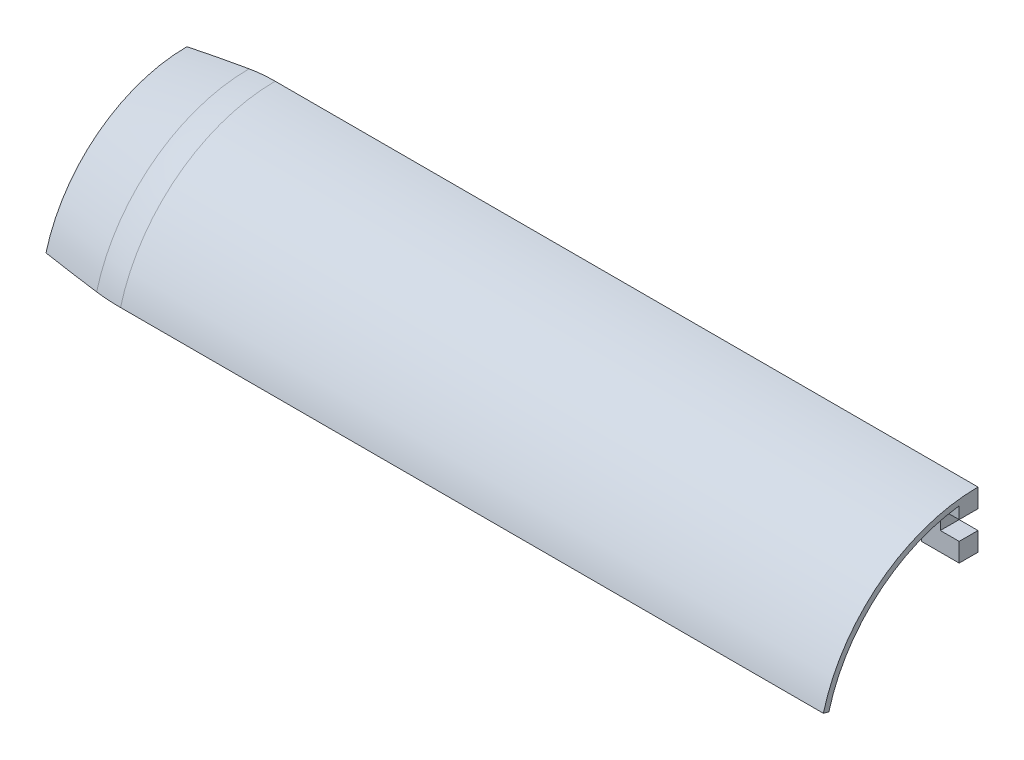
ISO-10303-21;
HEADER;
FILE_DESCRIPTION(('STEP AP214'),'2;1');
FILE_NAME('part.step','',(''),(''),'','','');
FILE_SCHEMA(('AUTOMOTIVE_DESIGN { 1 0 10303 214 1 1 1 1 }'));
ENDSEC;
DATA;
#1=APPLICATION_CONTEXT('core data for automotive mechanical design processes');
#2=APPLICATION_PROTOCOL_DEFINITION('international standard','automotive_design',2000,#1);
#3=PRODUCT_CONTEXT('',#1,'mechanical');
#4=PRODUCT('Part','Part','',(#3));
#5=PRODUCT_RELATED_PRODUCT_CATEGORY('part','',(#4));
#6=PRODUCT_DEFINITION_FORMATION('','',#4);
#7=PRODUCT_DEFINITION_CONTEXT('part definition',#1,'design');
#8=PRODUCT_DEFINITION('design','',#6,#7);
#9=PRODUCT_DEFINITION_SHAPE('','',#8);
#10=(LENGTH_UNIT() NAMED_UNIT(*) SI_UNIT(.MILLI.,.METRE.));
#11=(NAMED_UNIT(*) PLANE_ANGLE_UNIT() SI_UNIT($,.RADIAN.));
#12=(NAMED_UNIT(*) SI_UNIT($,.STERADIAN.) SOLID_ANGLE_UNIT());
#13=UNCERTAINTY_MEASURE_WITH_UNIT(LENGTH_MEASURE(1.E-05),#10,'distance_accuracy_value','');
#14=(GEOMETRIC_REPRESENTATION_CONTEXT(3) GLOBAL_UNCERTAINTY_ASSIGNED_CONTEXT((#13)) GLOBAL_UNIT_ASSIGNED_CONTEXT((#10,
#11,#12)) REPRESENTATION_CONTEXT('',''));
#15=CARTESIAN_POINT('',(0.,0.,0.));
#16=DIRECTION('',(0.,0.,1.));
#17=DIRECTION('',(1.,0.,0.));
#18=AXIS2_PLACEMENT_3D('',#15,#16,#17);
#19=CARTESIAN_POINT('',(530.,21.2119961273261,79.1642472771364));
#20=DIRECTION('',(-1.,0.,0.));
#21=DIRECTION('',(0.,0.,1.));
#22=AXIS2_PLACEMENT_3D('',#19,#20,#21);
#23=PLANE('',#22);
#24=DIRECTION('',(0.,1.,0.));
#25=VECTOR('',#24,1.);
#26=CARTESIAN_POINT('',(530.,81.956859546113,0.));
#27=LINE('',#26,#25);
#28=CARTESIAN_POINT('',(530.,55.,0.));
#29=VERTEX_POINT('',#28);
#30=CARTESIAN_POINT('',(530.,65.,0.));
#31=VERTEX_POINT('',#30);
#32=EDGE_CURVE('E220',#29,#31,#27,.T.);
#33=ORIENTED_EDGE('',*,*,#32,.T.);
#34=DIRECTION('',(0.,0.,-1.));
#35=VECTOR('',#34,1.);
#36=CARTESIAN_POINT('',(530.,65.,0.));
#37=LINE('',#36,#35);
#38=CARTESIAN_POINT('',(530.,65.,10.));
#39=VERTEX_POINT('',#38);
#40=EDGE_CURVE('E158',#39,#31,#37,.T.);
#41=ORIENTED_EDGE('',*,*,#40,.F.);
#42=DIRECTION('',(0.,-1.,0.));
#43=VECTOR('',#42,1.);
#44=CARTESIAN_POINT('',(530.,84.4097150806707,10.));
#45=LINE('',#44,#43);
#46=CARTESIAN_POINT('',(530.,55.,10.));
#47=VERTEX_POINT('',#46);
#48=EDGE_CURVE('E183',#39,#47,#45,.T.);
#49=ORIENTED_EDGE('',*,*,#48,.T.);
#50=DIRECTION('',(0.,0.,-1.));
#51=VECTOR('',#50,1.);
#52=CARTESIAN_POINT('',(530.,55.,0.));
#53=LINE('',#52,#51);
#54=EDGE_CURVE('E173',#47,#29,#53,.T.);
#55=ORIENTED_EDGE('',*,*,#54,.T.);
#56=EDGE_LOOP('',(#33,#41,#49,#55));
#57=FACE_BOUND('',#56,.T.);
#58=ADVANCED_FACE('F37',(#57),#23,.F.);
#59=CARTESIAN_POINT('',(150.,21.999618833714,82.1036952345709));
#60=CARTESIAN_POINT('',(149.933332963086,21.9966847445757,82.0927450648329));
#61=CARTESIAN_POINT('',(149.733326586977,21.9878822454263,82.0598936907736));
#62=CARTESIAN_POINT('',(149.399989369755,21.9731873612655,82.0050516364741));
#63=CARTESIAN_POINT('',(148.333178957117,21.9260724994005,81.8292165782023));
#64=CARTESIAN_POINT('',(145.198462088796,21.7867182564216,81.3091394631546));
#65=CARTESIAN_POINT('',(140.063409966275,21.5535060682111,80.4387797278088));
#66=CARTESIAN_POINT('',(133.663251007027,21.2532404153326,79.3181730554985));
#67=CARTESIAN_POINT('',(127.529872228265,20.9558385856644,78.208254316913));
#68=CARTESIAN_POINT('',(121.663178505039,20.6618353858161,77.1110194374911));
#69=CARTESIAN_POINT('',(116.063039295925,20.3718327705219,76.0287149428853));
#70=CARTESIAN_POINT('',(110.662900526555,20.0827540053217,74.9498583037688));
#71=CARTESIAN_POINT('',(105.462763855211,19.7948894494498,73.8755331555566));
#72=CARTESIAN_POINT('',(100.46263128834,19.5085646402747,72.8069544202478));
#73=CARTESIAN_POINT('',(95.6625052522908,19.2241439734207,71.7454820408259));
#74=CARTESIAN_POINT('',(91.0623885711703,18.9420346619876,70.6926357572692));
#75=CARTESIAN_POINT('',(86.6622846143895,18.6626908152326,69.650110328398));
#76=CARTESIAN_POINT('',(82.4621970688495,18.3866178123072,68.6197918548821));
#77=CARTESIAN_POINT('',(78.46213040735,18.1143763939732,67.6037730497351));
#78=CARTESIAN_POINT('',(74.6620888756832,17.8465873024523,66.6043705544663));
#79=CARTESIAN_POINT('',(70.9951359048108,17.5790502997852,65.6059088676082));
#80=CARTESIAN_POINT('',(67.4614975977933,17.31193144274,64.6090077214556));
#81=CARTESIAN_POINT('',(64.0614958695097,17.0454031162743,63.6143104654295));
#82=CARTESIAN_POINT('',(60.8615392806008,16.7853399551732,62.643741535023));
#83=CARTESIAN_POINT('',(57.7946028227797,16.5270327058151,61.6797257564551));
#84=CARTESIAN_POINT('',(54.8609921874534,16.2708187297285,60.7235221800909));
#85=CARTESIAN_POINT('',(51.9940338099678,16.0109786700254,59.7537858754372));
#86=CARTESIAN_POINT('',(49.2604049333765,15.7537120444895,58.7936537578452));
#87=CARTESIAN_POINT('',(46.6606093325559,15.4994615408708,57.8447779604903));
#88=CARTESIAN_POINT('',(44.193707143034,15.2489767414132,56.9099559623909));
#89=CARTESIAN_POINT('',(41.8601513478097,15.0028579090325,55.9914279752464));
#90=CARTESIAN_POINT('',(39.5932702297775,14.7543841176917,55.0641111616135));
#91=CARTESIAN_POINT('',(37.4597469179254,14.5112594793167,54.156757658626));
#92=CARTESIAN_POINT('',(35.3929098213764,14.2662937831752,53.2425332345145));
#93=CARTESIAN_POINT('',(33.4594457975844,14.0278960748922,52.3528208747944));
#94=CARTESIAN_POINT('',(31.5926828604072,13.788373699192,51.4589111991316));
#95=CARTESIAN_POINT('',(29.7917203934432,13.5478975782425,50.5614420977408));
#96=CARTESIAN_POINT('',(28.0582927499576,13.3064471318739,49.6603367643832));
#97=CARTESIAN_POINT('',(26.3915877567857,13.0642135961997,48.75630890195));
#98=CARTESIAN_POINT('',(24.790441055548,12.8214260788702,47.8502135518326));
#99=CARTESIAN_POINT('',(23.2571035986549,12.5781829793653,46.9424179458901));
#100=CARTESIAN_POINT('',(21.7905220441791,12.3347622735914,46.0339595043276));
#101=CARTESIAN_POINT('',(20.3891988556301,12.0914799304015,45.1260174389584));
#102=CARTESIAN_POINT('',(18.9876022764676,11.8361758965604,44.1732098132861));
#103=CARTESIAN_POINT('',(17.6543809034163,11.5804717073403,43.2189087874085));
#104=CARTESIAN_POINT('',(16.3879753215997,11.3247035989696,42.2643692120132));
#105=CARTESIAN_POINT('',(15.1861706225691,11.0692231951855,41.3109033647528));
#106=CARTESIAN_POINT('',(13.9839603207363,10.7991291966531,40.3028988394104));
#107=CARTESIAN_POINT('',(12.8510297890443,10.5288499296911,39.2942028828757));
#108=CARTESIAN_POINT('',(11.7850117433407,10.2587918718477,38.2863324900108));
#109=CARTESIAN_POINT('',(10.7826088420303,9.98931426489062,37.2806283693448));
#110=CARTESIAN_POINT('',(9.85034460299619,9.7218866438896,36.2825749004217));
#111=CARTESIAN_POINT('',(8.98508387628335,9.45725137908852,35.2949426467096));
#112=CARTESIAN_POINT('',(8.18277044424618,9.19609008232466,34.3202754182163));
#113=CARTESIAN_POINT('',(7.45148151123188,8.94118730900433,33.3689653171946));
#114=CARTESIAN_POINT('',(6.78722692689446,8.69389329151933,32.4460514795327));
#115=CARTESIAN_POINT('',(6.18542963153958,8.45554896723817,31.5565383516198));
#116=CARTESIAN_POINT('',(5.58321858881817,8.20028210803545,30.6038694635867));
#117=CARTESIAN_POINT('',(5.05331092004136,7.95811125529775,29.7000755370573));
#118=CARTESIAN_POINT('',(4.59033561481038,7.73137185104263,28.8538725602993));
#119=CARTESIAN_POINT('',(4.18913861433532,7.52252829796349,28.0744578093747));
#120=CARTESIAN_POINT('',(3.78768343871713,7.2991026398401,27.2406219015437));
#121=CARTESIAN_POINT('',(3.38587909275829,7.05832191891216,26.3420160175575));
#122=CARTESIAN_POINT('',(2.98358538597319,6.79645901339099,25.3647303495349));
#123=CARTESIAN_POINT('',(2.58057365558414,6.50830904792465,24.2893400382153));
#124=CARTESIAN_POINT('',(2.25380855212399,6.24788643176285,23.3174296032595));
#125=CARTESIAN_POINT('',(1.99350716667378,6.02041151317106,22.4684816496273));
#126=CARTESIAN_POINT('',(1.79270386413704,5.83216263964236,21.7659272891506));
#127=CARTESIAN_POINT('',(1.59169883745854,5.62841589361811,21.0055340811112));
#128=CARTESIAN_POINT('',(1.39040426817789,5.40561157891773,20.1740170585038));
#129=CARTESIAN_POINT('',(1.1886708633946,5.15866136750386,19.2523863225674));
#130=CARTESIAN_POINT('',(0.986227589019432,4.87985157629816,18.21185401614));
#131=CARTESIAN_POINT('',(0.782493434811414,4.55646326803867,17.0049524191419));
#132=CARTESIAN_POINT('',(0.57609845251901,4.16452685734478,15.542225821096));
#133=CARTESIAN_POINT('',(0.361573767311703,3.64565321011508,13.6057630069262));
#134=CARTESIAN_POINT('',(-0.0274375794679944,2.2478325689361,8.38902535417769));
#135=CARTESIAN_POINT('',(-0.01229422515827,1.00720837101644,3.7589528144421));
#136=CARTESIAN_POINT('',(0.,0.,0.));
#137=B_SPLINE_CURVE_WITH_KNOTS('',3,(#59,#60,#61,#62,#63,#64,#65,#66,#67,#68,#69,#70,#71,#72,
#73,#74,#75,#76,#77,#78,#79,#80,#81,#82,#83,#84,#85,#86,#87,#88,#89,#90,#91,#92,#93,#94,#95,#96,
#97,#98,#99,#100,#101,#102,#103,#104,#105,#106,#107,#108,#109,#110,#111,#112,#113,#114,#115,
#116,#117,#118,#119,#120,#121,#122,#123,#124,#125,#126,#127,#128,#129,#130,#131,#132,#133,#134,
#135,#136),.UNSPECIFIED.,.F.,.F.,(4,1,1,1,1,1,1,1,1,1,1,1,1,1,1,1,1,1,1,1,1,1,1,1,1,1,1,1,1,1,1,
1,1,1,1,1,1,1,1,1,1,1,1,1,1,1,1,1,1,1,1,1,1,1,1,1,1,1,1,1,1,1,1,1,1,1,1,1,1,1,1,1,1,1,1,4),(0.,
0.0010687252586431,0.00320626018393633,0.00534390825207476,0.0181722136864929,
0.0534725459687915,0.0877375176574445,0.120967753154723,0.152090007337628,0.182175910046259,
0.21122563995096,0.2392392707454,0.266216745901022,0.292157849275824,0.317062171203436,
0.340929069772287,0.363757627150992,0.385546601045925,0.406294371714183,0.425998885424918,
0.445756768666262,0.464472231486975,0.482142111039781,0.498762544311735,0.515442943349823,
0.5310723970131,0.546768661029466,0.561411566738944,0.574993781870311,0.588647474112505,
0.601234494645023,0.613898825914661,0.625487998856008,0.637159700915589,0.647744392134459,
0.658415550608988,0.669185411269821,0.678853400673226,0.688623655317672,0.698511438846342,
0.707274252510522,0.716156589654469,0.725177123576283,0.734358941510187,0.742379190684298,
0.750561858118709,0.758935380151752,0.767535832672319,0.774909459107764,0.782507468033389,
0.790374367643702,0.796900107721607,0.803673701632407,0.810745267983144,0.816283575468111,
0.822062632339849,0.828129061978545,0.834544121777166,0.839054210787859,0.843787411970255,
0.848784507322367,0.854098616344942,0.859800864190407,0.86598981856289,0.872808240763533,
0.876517565671207,0.880475407967659,0.884732346306742,0.889357005298599,0.894446203076064,
0.900143667243012,0.906678064851421,0.9144515629978,0.924294212224039,0.938537791451912,1.),.UNSPECIFIED.);
#138=CARTESIAN_POINT('',(0.,0.,0.));
#139=DIRECTION('',(-1.,0.,0.));
#140=AXIS1_PLACEMENT('',#138,#139);
#141=SURFACE_OF_REVOLUTION('',#137,#140);
#142=CARTESIAN_POINT('',(110.,0.,0.));
#143=DIRECTION('',(-1.,0.,0.));
#144=DIRECTION('',(0.,0.,1.));
#145=AXIS2_PLACEMENT_3D('',#142,#143,#144);
#146=CIRCLE('',#145,77.4478480750579);
#147=CARTESIAN_POINT('',(110.,20.0449780840314,74.8088766462106));
#148=VERTEX_POINT('',#147);
#149=CARTESIAN_POINT('',(109.999999993413,77.4478480736665,0.));
#150=VERTEX_POINT('',#149);
#151=EDGE_CURVE('E59',#148,#150,#146,.T.);
#152=ORIENTED_EDGE('',*,*,#151,.F.);
#153=CARTESIAN_POINT('',(143.011574454798,21.6869830367455,80.9369225560194));
#154=VERTEX_POINT('',#153);
#155=EDGE_CURVE('E225',#154,#148,#137,.T.);
#156=ORIENTED_EDGE('',*,*,#155,.F.);
#157=CARTESIAN_POINT('',(143.011574454798,0.,0.));
#158=DIRECTION('',(-1.,0.,0.));
#159=DIRECTION('',(0.,0.,1.));
#160=AXIS2_PLACEMENT_3D('',#157,#158,#159);
#161=CIRCLE('',#160,83.7920680379424);
#162=CARTESIAN_POINT('',(143.011574454798,83.7920680379424,0.));
#163=VERTEX_POINT('',#162);
#164=EDGE_CURVE('E313',#154,#163,#161,.T.);
#165=ORIENTED_EDGE('',*,*,#164,.T.);
#166=CARTESIAN_POINT('',(150.,85.,0.));
#167=CARTESIAN_POINT('',(149.933332963086,84.9886635500988,0.));
#168=CARTESIAN_POINT('',(149.733326586977,84.9546533050415,0.));
#169=CARTESIAN_POINT('',(149.399989369755,84.8978766325405,0.));
#170=CARTESIAN_POINT('',(148.333178957117,84.7158387850307,0.));
#171=CARTESIAN_POINT('',(145.198462088796,84.1774153358454,0.));
#172=CARTESIAN_POINT('',(140.063409966275,83.2763526334538,0.));
#173=CARTESIAN_POINT('',(133.663251007027,82.1162152380024,0.));
#174=CARTESIAN_POINT('',(127.529872228265,80.967142805754,0.));
#175=CARTESIAN_POINT('',(121.663178505039,79.8312016707734,0.));
#176=CARTESIAN_POINT('',(116.063039295925,78.7107176075573,0.));
#177=CARTESIAN_POINT('',(110.662900526555,77.5938030270026,0.));
#178=CARTESIAN_POINT('',(105.462763855211,76.481579791043,0.));
#179=CARTESIAN_POINT('',(100.46263128834,75.3753056794851,0.));
#180=CARTESIAN_POINT('',(95.6625052522908,74.2763886089064,0.));
#181=CARTESIAN_POINT('',(91.0623885711703,73.1864019299069,0.));
#182=CARTESIAN_POINT('',(86.6622846143895,72.1071001859247,0.));
#183=CARTESIAN_POINT('',(82.4621970688495,71.0404360120572,0.));
#184=CARTESIAN_POINT('',(78.46213040735,69.9885759442398,0.));
#185=CARTESIAN_POINT('',(74.6620888756832,68.9539183462456,0.));
#186=CARTESIAN_POINT('',(70.9951359048108,67.9202347447893,0.));
#187=CARTESIAN_POINT('',(67.4614975977933,66.888166733954,0.));
#188=CARTESIAN_POINT('',(64.0614958695097,65.8583803580709,0.));
#189=CARTESIAN_POINT('',(60.8615392806008,64.8535734629751,0.));
#190=CARTESIAN_POINT('',(57.7946028227797,63.8555508898842,0.));
#191=CARTESIAN_POINT('',(54.8609921874534,62.8656161036514,0.));
#192=CARTESIAN_POINT('',(51.9940338099678,61.8616712061645,0.));
#193=CARTESIAN_POINT('',(49.2604049333765,60.8676692947749,0.));
#194=CARTESIAN_POINT('',(46.6606093325559,59.8853207836057,0.));
#195=CARTESIAN_POINT('',(44.193707143034,58.91752183605,0.));
#196=CARTESIAN_POINT('',(41.8601513478097,57.9665916899193,0.));
#197=CARTESIAN_POINT('',(39.5932702297775,57.0065626810714,0.));
#198=CARTESIAN_POINT('',(37.4597469179254,56.0672012122168,0.));
#199=CARTESIAN_POINT('',(35.3929098213764,55.120726442385,0.));
#200=CARTESIAN_POINT('',(33.4594457975844,54.1996284289504,0.));
#201=CARTESIAN_POINT('',(31.5926828604072,53.2741850342985,0.));
#202=CARTESIAN_POINT('',(29.7917203934432,52.3450566509747,0.));
#203=CARTESIAN_POINT('',(28.0582927499576,51.412163763309,0.));
#204=CARTESIAN_POINT('',(26.3915877567857,50.4762452509048,0.));
#205=CARTESIAN_POINT('',(24.790441055548,49.538186317748,0.));
#206=CARTESIAN_POINT('',(23.2571035986549,48.5983671502348,0.));
#207=CARTESIAN_POINT('',(21.7905220441791,47.6578617647926,0.));
#208=CARTESIAN_POINT('',(20.3891988556301,46.7178909713236,0.));
#209=CARTESIAN_POINT('',(18.9876022764676,45.731471931952,0.));
#210=CARTESIAN_POINT('',(17.6543809034163,44.74350681092,0.));
#211=CARTESIAN_POINT('',(16.3879753215997,43.7552947252546,0.));
#212=CARTESIAN_POINT('',(15.1861706225691,42.7681942447512,0.));
#213=CARTESIAN_POINT('',(13.9839603207363,41.7246311699187,0.));
#214=CARTESIAN_POINT('',(12.8510297890443,40.6803522728424,0.));
#215=CARTESIAN_POINT('',(11.7850117433407,39.6369280621689,0.));
#216=CARTESIAN_POINT('',(10.7826088420303,38.595746541503,0.));
#217=CARTESIAN_POINT('',(9.85034460299619,37.5624855583513,0.));
#218=CARTESIAN_POINT('',(8.98508387628335,36.5400134110784,0.));
#219=CARTESIAN_POINT('',(8.18277044424618,35.530963645593,0.));
#220=CARTESIAN_POINT('',(7.45148151123188,34.5460949578217,0.));
#221=CARTESIAN_POINT('',(6.78722692689446,33.5906242451195,0.));
#222=CARTESIAN_POINT('',(6.18542963153958,32.6697324916292,0.));
#223=CARTESIAN_POINT('',(5.58321858881817,31.6834570840307,0.));
#224=CARTESIAN_POINT('',(5.05331092004136,30.7477807598956,0.));
#225=CARTESIAN_POINT('',(4.59033561481038,29.8717269742659,0.));
#226=CARTESIAN_POINT('',(4.18913861433532,29.0648174479734,0.));
#227=CARTESIAN_POINT('',(3.78768343871713,28.2015669942254,0.));
#228=CARTESIAN_POINT('',(3.38587909275829,27.2712617269582,0.));
#229=CARTESIAN_POINT('',(2.98358538597319,26.2595011533982,0.));
#230=CARTESIAN_POINT('',(2.58057365558414,25.1461751794452,0.));
#231=CARTESIAN_POINT('',(2.25380855212399,24.1399794566434,0.));
#232=CARTESIAN_POINT('',(1.99350716667378,23.2610838618401,0.));
#233=CARTESIAN_POINT('',(1.79270386413704,22.5337460669954,0.));
#234=CARTESIAN_POINT('',(1.59169883745854,21.7465290909666,0.));
#235=CARTESIAN_POINT('',(1.39040426817789,20.8856793238557,0.));
#236=CARTESIAN_POINT('',(1.1886708633946,19.9315369758068,0.));
#237=CARTESIAN_POINT('',(0.986227589019432,18.8542986640155,0.));
#238=CARTESIAN_POINT('',(0.782493434811414,17.6048221885444,0.));
#239=CARTESIAN_POINT('',(0.57609845251901,16.0904961831353,0.));
#240=CARTESIAN_POINT('',(0.361573767311703,14.0857223573754,0.));
#241=CARTESIAN_POINT('',(-0.0274375794679944,8.68495812603642,0.));
#242=CARTESIAN_POINT('',(-0.01229422515827,3.89155431207734,0.));
#243=CARTESIAN_POINT('',(0.,0.,0.));
#244=B_SPLINE_CURVE_WITH_KNOTS('',3,(#166,#167,#168,#169,#170,#171,#172,#173,#174,#175,#176,
#177,#178,#179,#180,#181,#182,#183,#184,#185,#186,#187,#188,#189,#190,#191,#192,#193,#194,#195,
#196,#197,#198,#199,#200,#201,#202,#203,#204,#205,#206,#207,#208,#209,#210,#211,#212,#213,#214,
#215,#216,#217,#218,#219,#220,#221,#222,#223,#224,#225,#226,#227,#228,#229,#230,#231,#232,#233,
#234,#235,#236,#237,#238,#239,#240,#241,#242,#243),.UNSPECIFIED.,.F.,.F.,(4,1,1,1,1,1,1,1,1,1,1,
1,1,1,1,1,1,1,1,1,1,1,1,1,1,1,1,1,1,1,1,1,1,1,1,1,1,1,1,1,1,1,1,1,1,1,1,1,1,1,1,1,1,1,1,1,1,1,1,
1,1,1,1,1,1,1,1,1,1,1,1,1,1,1,1,4),(0.,0.0010687252586431,0.00320626018393633,
0.00534390825207476,0.0181722136864929,0.0534725459687915,0.0877375176574445,0.120967753154723,
0.152090007337628,0.182175910046259,0.21122563995096,0.2392392707454,0.266216745901022,
0.292157849275824,0.317062171203436,0.340929069772287,0.363757627150992,0.385546601045925,
0.406294371714183,0.425998885424918,0.445756768666262,0.464472231486975,0.482142111039781,
0.498762544311735,0.515442943349823,0.5310723970131,0.546768661029466,0.561411566738944,
0.574993781870311,0.588647474112505,0.601234494645023,0.613898825914661,0.625487998856008,
0.637159700915589,0.647744392134459,0.658415550608988,0.669185411269821,0.678853400673226,
0.688623655317672,0.698511438846342,0.707274252510522,0.716156589654469,0.725177123576283,
0.734358941510187,0.742379190684298,0.750561858118709,0.758935380151752,0.767535832672319,
0.774909459107764,0.782507468033389,0.790374367643702,0.796900107721607,0.803673701632407,
0.810745267983144,0.816283575468111,0.822062632339849,0.828129061978545,0.834544121777166,
0.839054210787859,0.843787411970255,0.848784507322367,0.854098616344942,0.859800864190407,
0.86598981856289,0.872808240763533,0.876517565671207,0.880475407967659,0.884732346306742,
0.889357005298599,0.894446203076064,0.900143667243012,0.906678064851421,0.9144515629978,
0.924294212224039,0.938537791451912,1.),.UNSPECIFIED.);
#245=EDGE_CURVE('E202',#163,#150,#244,.T.);
#246=ORIENTED_EDGE('',*,*,#245,.T.);
#247=EDGE_LOOP('',(#152,#156,#165,#246));
#248=FACE_BOUND('',#247,.T.);
#249=ADVANCED_FACE('F240',(#248),#141,.T.);
#250=CARTESIAN_POINT('',(2.99998502922989,0.00245297648317682,0.00915463286498761));
#251=CARTESIAN_POINT('',(2.99378515333313,0.510379813846981,1.9047633964345));
#252=CARTESIAN_POINT('',(2.98195040978965,1.53196445841474,5.71736919419362));
#253=CARTESIAN_POINT('',(3.14536866129644,3.02998172837799,11.3080457563122));
#254=CARTESIAN_POINT('',(3.67380568909732,4.49011061965403,16.7573209641536));
#255=CARTESIAN_POINT('',(4.82699544242553,5.89020638688109,21.9825495029072));
#256=CARTESIAN_POINT('',(6.76738537381217,7.20782888698354,26.8999836184855));
#257=CARTESIAN_POINT('',(10.4622641517895,8.82730131497203,32.9439370011956));
#258=CARTESIAN_POINT('',(16.9322549212883,10.562110743851,39.4183339312216));
#259=CARTESIAN_POINT('',(26.3776177431232,12.2314373226928,45.6483455378845));
#260=CARTESIAN_POINT('',(36.6730106596153,13.6067155841847,50.780953884317));
#261=CARTESIAN_POINT('',(47.4413847705489,14.7736627697221,55.1360600704922));
#262=CARTESIAN_POINT('',(62.1774895395736,16.12711152704,60.1871995982437));
#263=CARTESIAN_POINT('',(81.0422134548498,17.5369417430137,65.4487575943033));
#264=CARTESIAN_POINT('',(104.01815223485,18.9504483026532,70.72403589171));
#265=CARTESIAN_POINT('',(126.982089982513,20.1604430503343,75.2397977669472));
#266=CARTESIAN_POINT('',(142.389605545499,20.8763328822037,77.9115349921061));
#267=CARTESIAN_POINT('',(150.167563431523,21.2193872790099,79.1918314307464));
#268=CARTESIAN_POINT('',(150.377257553914,21.2286193611267,79.2262860302661));
#269=CARTESIAN_POINT('',(150.502918144044,21.2341498210013,79.2469259875074));
#270=B_SPLINE_CURVE_WITH_KNOTS('',3,(#250,#251,#252,#253,#254,#255,#256,#257,#258,#259,#260,
#261,#262,#263,#264,#265,#266,#267,#268,#269),.UNSPECIFIED.,.F.,.F.,(4,1,1,1,1,1,1,1,1,1,1,1,1,
1,1,1,1,4),(0.,0.03125,0.0625,0.09375,0.125,0.15625,0.1875,0.25,0.3125,0.375,0.4375,0.5,0.625,
0.75,0.875,0.996633750979396,0.997980250587638,1.),.UNSPECIFIED.);
#271=CARTESIAN_POINT('',(0.,0.,0.));
#272=DIRECTION('',(-1.,0.,0.));
#273=AXIS1_PLACEMENT('',#271,#272);
#274=SURFACE_OF_REVOLUTION('',#270,#273);
#275=CARTESIAN_POINT('',(110.,0.,0.));
#276=DIRECTION('',(-1.,0.,0.));
#277=DIRECTION('',(0.,0.,1.));
#278=AXIS2_PLACEMENT_3D('',#275,#276,#277);
#279=CIRCLE('',#278,74.3816262334599);
#280=CARTESIAN_POINT('',(110.,74.3816262334599,0.));
#281=VERTEX_POINT('',#280);
#282=CARTESIAN_POINT('',(110.,19.2513814749155,71.8471337802797));
#283=VERTEX_POINT('',#282);
#284=EDGE_CURVE('E196',#281,#283,#279,.F.);
#285=ORIENTED_EDGE('',*,*,#284,.F.);
#286=CARTESIAN_POINT('',(2.99998502922989,0.00947757334552098,0.));
#287=CARTESIAN_POINT('',(2.99378515333313,1.97195617364565,0.));
#288=CARTESIAN_POINT('',(2.98195040978965,5.91905614135904,0.));
#289=CARTESIAN_POINT('',(3.14536866129644,11.7069504184973,0.));
#290=CARTESIAN_POINT('',(3.67380568909732,17.3484552416747,0.));
#291=CARTESIAN_POINT('',(4.82699544242553,22.7580098850453,0.));
#292=CARTESIAN_POINT('',(6.76738537381217,27.8489122936395,0.));
#293=CARTESIAN_POINT('',(10.4622641517895,34.1060732662681,0.));
#294=CARTESIAN_POINT('',(16.9322549212883,40.8088621904442,0.));
#295=CARTESIAN_POINT('',(26.3776177431232,47.2586448105006,0.));
#296=CARTESIAN_POINT('',(36.6730106596153,52.5723119749363,0.));
#297=CARTESIAN_POINT('',(47.4413847705489,57.08104967264,0.));
#298=CARTESIAN_POINT('',(62.1774895395736,62.310374109649,0.));
#299=CARTESIAN_POINT('',(81.0422134548498,67.7575397748157,0.));
#300=CARTESIAN_POINT('',(104.01815223485,73.2189097411551,0.));
#301=CARTESIAN_POINT('',(126.982089982513,77.8939704469921,0.));
#302=CARTESIAN_POINT('',(142.389605545499,80.659956356514,0.));
#303=CARTESIAN_POINT('',(150.167563431523,81.9854167633022,0.));
#304=CARTESIAN_POINT('',(150.377257553914,82.0210867894906,0.));
#305=CARTESIAN_POINT('',(150.502918144044,82.0424548455871,0.));
#306=B_SPLINE_CURVE_WITH_KNOTS('',3,(#286,#287,#288,#289,#290,#291,#292,#293,#294,#295,#296,
#297,#298,#299,#300,#301,#302,#303,#304,#305),.UNSPECIFIED.,.F.,.F.,(4,1,1,1,1,1,1,1,1,1,1,1,1,
1,1,1,1,4),(0.,0.03125,0.0625,0.09375,0.125,0.15625,0.1875,0.25,0.3125,0.375,0.4375,0.5,0.625,
0.75,0.875,0.996633750979396,0.997980250587638,1.),.UNSPECIFIED.);
#307=CARTESIAN_POINT('',(142.99356344036,80.7428237295815,0.));
#308=VERTEX_POINT('',#307);
#309=EDGE_CURVE('E207',#281,#308,#306,.T.);
#310=ORIENTED_EDGE('',*,*,#309,.T.);
#311=CARTESIAN_POINT('',(142.99356344036,0.,0.));
#312=DIRECTION('',(-1.,0.,0.));
#313=DIRECTION('',(0.,0.,1.));
#314=AXIS2_PLACEMENT_3D('',#311,#312,#313);
#315=CIRCLE('',#314,80.7428237295816);
#316=CARTESIAN_POINT('',(142.99356344036,20.8977805365712,77.9915787279087));
#317=VERTEX_POINT('',#316);
#318=EDGE_CURVE('E299',#308,#317,#315,.F.);
#319=ORIENTED_EDGE('',*,*,#318,.T.);
#320=EDGE_CURVE('E231',#283,#317,#270,.T.);
#321=ORIENTED_EDGE('',*,*,#320,.F.);
#322=EDGE_LOOP('',(#285,#310,#319,#321));
#323=FACE_BOUND('',#322,.T.);
#324=ADVANCED_FACE('F244',(#323),#274,.T.);
#325=CARTESIAN_POINT('',(57.5770541421168,16.5067894793465,61.6041770067651));
#326=DIRECTION('',(0.,-0.965925826289069,0.258819045102518));
#327=DIRECTION('',(1.,0.,0.));
#328=AXIS2_PLACEMENT_3D('',#325,#326,#327);
#329=PLANE('',#328);
#330=ORIENTED_EDGE('',*,*,#155,.T.);
#331=DIRECTION('',(0.,-0.258819045102518,-0.965925826289069));
#332=VECTOR('',#331,1.);
#333=CARTESIAN_POINT('',(110.,16.5067894793465,61.6041770067651));
#334=LINE('',#333,#332);
#335=EDGE_CURVE('E199',#148,#283,#334,.T.);
#336=ORIENTED_EDGE('',*,*,#335,.T.);
#337=ORIENTED_EDGE('',*,*,#320,.T.);
#338=CARTESIAN_POINT('',(156.877793620085,0.506472519128606,1.89018117402538));
#339=DIRECTION('',(0.,-0.965925826289069,0.258819045102518));
#340=DIRECTION('',(0.,-0.258819045102518,-0.965925826289069));
#341=AXIS2_PLACEMENT_3D('',#338,#339,#340);
#342=CIRCLE('',#341,80.);
#343=CARTESIAN_POINT('',(156.877793620085,21.2119961273262,79.1642472771364));
#344=VERTEX_POINT('',#343);
#345=EDGE_CURVE('E311',#317,#344,#342,.F.);
#346=ORIENTED_EDGE('',*,*,#345,.T.);
#347=DIRECTION('',(1.,0.,0.));
#348=VECTOR('',#347,1.);
#349=CARTESIAN_POINT('',(150.,21.2119961273262,79.1642472771364));
#350=LINE('',#349,#348);
#351=CARTESIAN_POINT('',(530.,21.2119961273261,79.1642472771364));
#352=VERTEX_POINT('',#351);
#353=EDGE_CURVE('E298',#344,#352,#350,.T.);
#354=ORIENTED_EDGE('',*,*,#353,.T.);
#355=DIRECTION('',(0.,0.258819045102518,0.965925826289069));
#356=VECTOR('',#355,1.);
#357=CARTESIAN_POINT('',(530.,21.2119961273261,79.1642472771364));
#358=LINE('',#357,#356);
#359=CARTESIAN_POINT('',(530.,21.999618833714,82.1036952345709));
#360=VERTEX_POINT('',#359);
#361=EDGE_CURVE('E334',#352,#360,#358,.T.);
#362=ORIENTED_EDGE('',*,*,#361,.T.);
#363=DIRECTION('',(-1.,0.,0.));
#364=VECTOR('',#363,1.);
#365=CARTESIAN_POINT('',(150.,21.999618833714,82.1036952345709));
#366=LINE('',#365,#364);
#367=CARTESIAN_POINT('',(156.861123700324,21.999618833714,82.1036952345709));
#368=VERTEX_POINT('',#367);
#369=EDGE_CURVE('E326',#360,#368,#366,.T.);
#370=ORIENTED_EDGE('',*,*,#369,.T.);
#371=CARTESIAN_POINT('',(156.861123700324,1.29409522551259,4.82962913144535));
#372=DIRECTION('',(0.,-0.965925826289069,0.258819045102518));
#373=DIRECTION('',(0.,-0.258819045102518,-0.965925826289069));
#374=AXIS2_PLACEMENT_3D('',#371,#372,#373);
#375=CIRCLE('',#374,80.);
#376=EDGE_CURVE('E45',#368,#154,#375,.T.);
#377=ORIENTED_EDGE('',*,*,#376,.T.);
#378=EDGE_LOOP('',(#330,#336,#337,#346,#354,#362,#370,#377));
#379=FACE_BOUND('',#378,.T.);
#380=ADVANCED_FACE('F246',(#379),#329,.T.);
#381=CARTESIAN_POINT('',(57.5770541421168,63.7773370688704,0.));
#382=DIRECTION('',(0.,0.,1.));
#383=DIRECTION('',(1.,0.,0.));
#384=AXIS2_PLACEMENT_3D('',#381,#382,#383);
#385=PLANE('',#384);
#386=DIRECTION('',(0.,1.,0.));
#387=VECTOR('',#386,1.);
#388=CARTESIAN_POINT('',(520.,65.,0.));
#389=LINE('',#388,#387);
#390=CARTESIAN_POINT('',(520.,65.,0.));
#391=VERTEX_POINT('',#390);
#392=CARTESIAN_POINT('',(520.,75.,0.));
#393=VERTEX_POINT('',#392);
#394=EDGE_CURVE('E149',#391,#393,#389,.T.);
#395=ORIENTED_EDGE('',*,*,#394,.F.);
#396=DIRECTION('',(1.,0.,0.));
#397=VECTOR('',#396,1.);
#398=CARTESIAN_POINT('',(520.,65.,0.));
#399=LINE('',#398,#397);
#400=EDGE_CURVE('E281',#391,#31,#399,.T.);
#401=ORIENTED_EDGE('',*,*,#400,.T.);
#402=ORIENTED_EDGE('',*,*,#32,.F.);
#403=DIRECTION('',(1.,0.,0.));
#404=VECTOR('',#403,1.);
#405=CARTESIAN_POINT('',(510.,55.,0.));
#406=LINE('',#405,#404);
#407=CARTESIAN_POINT('',(510.,55.,0.));
#408=VERTEX_POINT('',#407);
#409=EDGE_CURVE('E186',#408,#29,#406,.T.);
#410=ORIENTED_EDGE('',*,*,#409,.F.);
#411=DIRECTION('',(0.,1.,0.));
#412=VECTOR('',#411,1.);
#413=CARTESIAN_POINT('',(510.,85.,0.));
#414=LINE('',#413,#412);
#415=CARTESIAN_POINT('',(510.,81.9568595461281,0.));
#416=VERTEX_POINT('',#415);
#417=EDGE_CURVE('E176',#408,#416,#414,.T.);
#418=ORIENTED_EDGE('',*,*,#417,.T.);
#419=DIRECTION('',(1.,0.,0.));
#420=VECTOR('',#419,1.);
#421=CARTESIAN_POINT('',(150.,81.956859546113,0.));
#422=LINE('',#421,#420);
#423=CARTESIAN_POINT('',(156.877793620085,81.956859546113,0.));
#424=VERTEX_POINT('',#423);
#425=EDGE_CURVE('E214',#424,#416,#422,.T.);
#426=ORIENTED_EDGE('',*,*,#425,.F.);
#427=CARTESIAN_POINT('',(156.877793620085,1.95685954612804,0.));
#428=DIRECTION('',(0.,0.,1.));
#429=DIRECTION('',(1.,0.,0.));
#430=AXIS2_PLACEMENT_3D('',#427,#428,#429);
#431=CIRCLE('',#430,80.);
#432=EDGE_CURVE('E303',#424,#308,#431,.T.);
#433=ORIENTED_EDGE('',*,*,#432,.T.);
#434=ORIENTED_EDGE('',*,*,#309,.F.);
#435=DIRECTION('',(0.,-1.,0.));
#436=VECTOR('',#435,1.);
#437=CARTESIAN_POINT('',(110.,63.7773370688704,0.));
#438=LINE('',#437,#436);
#439=EDGE_CURVE('E11',#150,#281,#438,.T.);
#440=ORIENTED_EDGE('',*,*,#439,.F.);
#441=ORIENTED_EDGE('',*,*,#245,.F.);
#442=CARTESIAN_POINT('',(156.861123700324,5.,0.));
#443=DIRECTION('',(0.,0.,1.));
#444=DIRECTION('',(1.,0.,0.));
#445=AXIS2_PLACEMENT_3D('',#442,#443,#444);
#446=CIRCLE('',#445,80.);
#447=CARTESIAN_POINT('',(156.861123700324,85.,0.));
#448=VERTEX_POINT('',#447);
#449=EDGE_CURVE('E316',#163,#448,#446,.F.);
#450=ORIENTED_EDGE('',*,*,#449,.T.);
#451=DIRECTION('',(-1.,0.,0.));
#452=VECTOR('',#451,1.);
#453=CARTESIAN_POINT('',(150.,85.,0.));
#454=LINE('',#453,#452);
#455=CARTESIAN_POINT('',(530.,85.,0.));
#456=VERTEX_POINT('',#455);
#457=EDGE_CURVE('E223',#456,#448,#454,.T.);
#458=ORIENTED_EDGE('',*,*,#457,.F.);
#459=CARTESIAN_POINT('',(530.,75.,0.));
#460=VERTEX_POINT('',#459);
#461=EDGE_CURVE('E163',#460,#456,#27,.T.);
#462=ORIENTED_EDGE('',*,*,#461,.F.);
#463=DIRECTION('',(1.,0.,0.));
#464=VECTOR('',#463,1.);
#465=CARTESIAN_POINT('',(520.,75.,0.));
#466=LINE('',#465,#464);
#467=EDGE_CURVE('E143',#393,#460,#466,.T.);
#468=ORIENTED_EDGE('',*,*,#467,.F.);
#469=EDGE_LOOP('',(#395,#401,#402,#410,#418,#426,#433,#434,#440,#441,#450,#458,#462,#468));
#470=FACE_BOUND('',#469,.T.);
#471=ADVANCED_FACE('F161',(#470),#385,.F.);
#472=CARTESIAN_POINT('',(0.,0.,0.));
#473=DIRECTION('',(-1.,0.,0.));
#474=DIRECTION('',(0.,0.,1.));
#475=AXIS2_PLACEMENT_3D('',#472,#473,#474);
#476=CYLINDRICAL_SURFACE('',#475,81.9568595461281);
#477=CARTESIAN_POINT('',(510.,0.,0.));
#478=DIRECTION('',(1.,0.,0.));
#479=DIRECTION('',(0.,0.,-1.));
#480=AXIS2_PLACEMENT_3D('',#477,#478,#479);
#481=CIRCLE('',#480,81.9568595461281);
#482=CARTESIAN_POINT('',(510.,81.3444947532638,10.));
#483=VERTEX_POINT('',#482);
#484=EDGE_CURVE('E189',#483,#416,#481,.F.);
#485=ORIENTED_EDGE('',*,*,#484,.F.);
#486=DIRECTION('',(-1.,0.,0.));
#487=VECTOR('',#486,1.);
#488=CARTESIAN_POINT('',(0.,81.3444947532638,10.));
#489=LINE('',#488,#487);
#490=CARTESIAN_POINT('',(530.,81.3444947532486,10.));
#491=VERTEX_POINT('',#490);
#492=EDGE_CURVE('E193',#483,#491,#489,.F.);
#493=ORIENTED_EDGE('',*,*,#492,.T.);
#494=CARTESIAN_POINT('',(530.,0.,0.));
#495=DIRECTION('',(-1.,0.,0.));
#496=DIRECTION('',(0.,0.,1.));
#497=AXIS2_PLACEMENT_3D('',#494,#495,#496);
#498=CIRCLE('',#497,81.956859546113);
#499=EDGE_CURVE('E300',#352,#491,#498,.T.);
#500=ORIENTED_EDGE('',*,*,#499,.F.);
#501=ORIENTED_EDGE('',*,*,#353,.F.);
#502=CARTESIAN_POINT('',(156.877793620085,0.,0.));
#503=DIRECTION('',(-1.,0.,0.));
#504=DIRECTION('',(0.,0.,1.));
#505=AXIS2_PLACEMENT_3D('',#502,#503,#504);
#506=CIRCLE('',#505,81.9568595461281);
#507=EDGE_CURVE('E296',#344,#424,#506,.T.);
#508=ORIENTED_EDGE('',*,*,#507,.T.);
#509=ORIENTED_EDGE('',*,*,#425,.T.);
#510=EDGE_LOOP('',(#485,#493,#500,#501,#508,#509));
#511=FACE_BOUND('',#510,.T.);
#512=ADVANCED_FACE('F256',(#511),#476,.F.);
#513=CARTESIAN_POINT('',(530.,75.,10.));
#514=VERTEX_POINT('',#513);
#515=EDGE_CURVE('E180',#491,#514,#45,.T.);
#516=ORIENTED_EDGE('',*,*,#515,.T.);
#517=DIRECTION('',(0.,0.,1.));
#518=VECTOR('',#517,1.);
#519=CARTESIAN_POINT('',(530.,75.,0.));
#520=LINE('',#519,#518);
#521=EDGE_CURVE('E339',#460,#514,#520,.T.);
#522=ORIENTED_EDGE('',*,*,#521,.F.);
#523=ORIENTED_EDGE('',*,*,#461,.T.);
#524=CARTESIAN_POINT('',(530.,0.,0.));
#525=DIRECTION('',(-1.,0.,0.));
#526=DIRECTION('',(0.,0.,1.));
#527=AXIS2_PLACEMENT_3D('',#524,#525,#526);
#528=CIRCLE('',#527,85.);
#529=EDGE_CURVE('E306',#360,#456,#528,.T.);
#530=ORIENTED_EDGE('',*,*,#529,.F.);
#531=ORIENTED_EDGE('',*,*,#361,.F.);
#532=ORIENTED_EDGE('',*,*,#499,.T.);
#533=EDGE_LOOP('',(#516,#522,#523,#530,#531,#532));
#534=FACE_BOUND('',#533,.T.);
#535=ADVANCED_FACE('F252',(#534),#23,.F.);
#536=CARTESIAN_POINT('',(0.,0.,0.));
#537=DIRECTION('',(-1.,0.,0.));
#538=DIRECTION('',(0.,0.,1.));
#539=AXIS2_PLACEMENT_3D('',#536,#537,#538);
#540=CYLINDRICAL_SURFACE('',#539,85.);
#541=ORIENTED_EDGE('',*,*,#529,.T.);
#542=ORIENTED_EDGE('',*,*,#457,.T.);
#543=CARTESIAN_POINT('',(156.861123700324,0.,0.));
#544=DIRECTION('',(1.,0.,0.));
#545=DIRECTION('',(0.,0.,-1.));
#546=AXIS2_PLACEMENT_3D('',#543,#544,#545);
#547=CIRCLE('',#546,85.);
#548=EDGE_CURVE('E319',#448,#368,#547,.T.);
#549=ORIENTED_EDGE('',*,*,#548,.T.);
#550=ORIENTED_EDGE('',*,*,#369,.F.);
#551=EDGE_LOOP('',(#541,#542,#549,#550));
#552=FACE_BOUND('',#551,.T.);
#553=ADVANCED_FACE('F248',(#552),#540,.T.);
#554=CARTESIAN_POINT('',(156.877793620085,0.,0.));
#555=DIRECTION('',(-1.,0.,0.));
#556=DIRECTION('',(0.,0.,1.));
#557=AXIS2_PLACEMENT_3D('',#554,#555,#556);
#558=DEGENERATE_TOROIDAL_SURFACE('',#557,1.95685954612804,80.,.T.);
#559=ORIENTED_EDGE('',*,*,#345,.F.);
#560=ORIENTED_EDGE('',*,*,#318,.F.);
#561=ORIENTED_EDGE('',*,*,#432,.F.);
#562=ORIENTED_EDGE('',*,*,#507,.F.);
#563=EDGE_LOOP('',(#559,#560,#561,#562));
#564=FACE_BOUND('',#563,.T.);
#565=ADVANCED_FACE('F251',(#564),#558,.F.);
#566=CARTESIAN_POINT('',(156.861123700324,0.,0.));
#567=DIRECTION('',(1.,0.,0.));
#568=DIRECTION('',(0.,0.,-1.));
#569=AXIS2_PLACEMENT_3D('',#566,#567,#568);
#570=DEGENERATE_TOROIDAL_SURFACE('',#569,5.,80.,.T.);
#571=ORIENTED_EDGE('',*,*,#376,.F.);
#572=ORIENTED_EDGE('',*,*,#548,.F.);
#573=ORIENTED_EDGE('',*,*,#449,.F.);
#574=ORIENTED_EDGE('',*,*,#164,.F.);
#575=EDGE_LOOP('',(#571,#572,#573,#574));
#576=FACE_BOUND('',#575,.T.);
#577=ADVANCED_FACE('F39',(#576),#570,.T.);
#578=CARTESIAN_POINT('',(110.,159.,104.453052002356));
#579=DIRECTION('',(-1.,0.,0.));
#580=DIRECTION('',(0.,0.,1.));
#581=AXIS2_PLACEMENT_3D('',#578,#579,#580);
#582=PLANE('',#581);
#583=ORIENTED_EDGE('',*,*,#151,.T.);
#584=ORIENTED_EDGE('',*,*,#439,.T.);
#585=ORIENTED_EDGE('',*,*,#284,.T.);
#586=ORIENTED_EDGE('',*,*,#335,.F.);
#587=EDGE_LOOP('',(#583,#584,#585,#586));
#588=FACE_BOUND('',#587,.T.);
#589=ADVANCED_FACE('F269',(#588),#582,.T.);
#590=CARTESIAN_POINT('',(510.,84.4097150806707,10.));
#591=DIRECTION('',(0.,0.,1.));
#592=DIRECTION('',(0.,-1.,0.));
#593=AXIS2_PLACEMENT_3D('',#590,#591,#592);
#594=PLANE('',#593);
#595=DIRECTION('',(1.,0.,0.));
#596=VECTOR('',#595,1.);
#597=CARTESIAN_POINT('',(520.,65.,10.));
#598=LINE('',#597,#596);
#599=CARTESIAN_POINT('',(520.,65.,10.));
#600=VERTEX_POINT('',#599);
#601=EDGE_CURVE('E165',#600,#39,#598,.T.);
#602=ORIENTED_EDGE('',*,*,#601,.F.);
#603=DIRECTION('',(0.,-1.,0.));
#604=VECTOR('',#603,1.);
#605=CARTESIAN_POINT('',(520.,65.,10.));
#606=LINE('',#605,#604);
#607=CARTESIAN_POINT('',(520.,75.,10.));
#608=VERTEX_POINT('',#607);
#609=EDGE_CURVE('E148',#608,#600,#606,.T.);
#610=ORIENTED_EDGE('',*,*,#609,.F.);
#611=DIRECTION('',(1.,0.,0.));
#612=VECTOR('',#611,1.);
#613=CARTESIAN_POINT('',(520.,75.,10.));
#614=LINE('',#613,#612);
#615=EDGE_CURVE('E146',#608,#514,#614,.T.);
#616=ORIENTED_EDGE('',*,*,#615,.T.);
#617=ORIENTED_EDGE('',*,*,#515,.F.);
#618=ORIENTED_EDGE('',*,*,#492,.F.);
#619=DIRECTION('',(0.,-1.,0.));
#620=VECTOR('',#619,1.);
#621=CARTESIAN_POINT('',(510.,84.4097150806707,10.));
#622=LINE('',#621,#620);
#623=CARTESIAN_POINT('',(510.,55.,10.));
#624=VERTEX_POINT('',#623);
#625=EDGE_CURVE('E170',#483,#624,#622,.T.);
#626=ORIENTED_EDGE('',*,*,#625,.T.);
#627=DIRECTION('',(1.,0.,0.));
#628=VECTOR('',#627,1.);
#629=CARTESIAN_POINT('',(510.,55.,10.));
#630=LINE('',#629,#628);
#631=EDGE_CURVE('E179',#624,#47,#630,.T.);
#632=ORIENTED_EDGE('',*,*,#631,.T.);
#633=ORIENTED_EDGE('',*,*,#48,.F.);
#634=EDGE_LOOP('',(#602,#610,#616,#617,#618,#626,#632,#633));
#635=FACE_BOUND('',#634,.T.);
#636=ADVANCED_FACE('F348',(#635),#594,.T.);
#637=CARTESIAN_POINT('',(510.,6.93889390390723E-13,0.));
#638=DIRECTION('',(1.,0.,0.));
#639=DIRECTION('',(0.,0.,-1.));
#640=AXIS2_PLACEMENT_3D('',#637,#638,#639);
#641=PLANE('',#640);
#642=ORIENTED_EDGE('',*,*,#625,.F.);
#643=ORIENTED_EDGE('',*,*,#484,.T.);
#644=ORIENTED_EDGE('',*,*,#417,.F.);
#645=DIRECTION('',(0.,0.,-1.));
#646=VECTOR('',#645,1.);
#647=CARTESIAN_POINT('',(510.,55.,0.));
#648=LINE('',#647,#646);
#649=EDGE_CURVE('E172',#624,#408,#648,.T.);
#650=ORIENTED_EDGE('',*,*,#649,.F.);
#651=EDGE_LOOP('',(#642,#643,#644,#650));
#652=FACE_BOUND('',#651,.T.);
#653=ADVANCED_FACE('F289',(#652),#641,.F.);
#654=CARTESIAN_POINT('',(510.,55.,0.));
#655=DIRECTION('',(0.,-1.,0.));
#656=DIRECTION('',(0.,0.,-1.));
#657=AXIS2_PLACEMENT_3D('',#654,#655,#656);
#658=PLANE('',#657);
#659=ORIENTED_EDGE('',*,*,#54,.F.);
#660=ORIENTED_EDGE('',*,*,#631,.F.);
#661=ORIENTED_EDGE('',*,*,#649,.T.);
#662=ORIENTED_EDGE('',*,*,#409,.T.);
#663=EDGE_LOOP('',(#659,#660,#661,#662));
#664=FACE_BOUND('',#663,.T.);
#665=ADVANCED_FACE('F283',(#664),#658,.T.);
#666=CARTESIAN_POINT('',(520.,65.,0.));
#667=DIRECTION('',(0.,-1.,0.));
#668=DIRECTION('',(0.,0.,-1.));
#669=AXIS2_PLACEMENT_3D('',#666,#667,#668);
#670=PLANE('',#669);
#671=ORIENTED_EDGE('',*,*,#40,.T.);
#672=ORIENTED_EDGE('',*,*,#400,.F.);
#673=DIRECTION('',(0.,0.,-1.));
#674=VECTOR('',#673,1.);
#675=CARTESIAN_POINT('',(520.,65.,0.));
#676=LINE('',#675,#674);
#677=EDGE_CURVE('E155',#600,#391,#676,.T.);
#678=ORIENTED_EDGE('',*,*,#677,.F.);
#679=ORIENTED_EDGE('',*,*,#601,.T.);
#680=EDGE_LOOP('',(#671,#672,#678,#679));
#681=FACE_BOUND('',#680,.T.);
#682=ADVANCED_FACE('F346',(#681),#670,.F.);
#683=CARTESIAN_POINT('',(520.,75.,0.));
#684=DIRECTION('',(0.,1.,0.));
#685=DIRECTION('',(0.,0.,1.));
#686=AXIS2_PLACEMENT_3D('',#683,#684,#685);
#687=PLANE('',#686);
#688=ORIENTED_EDGE('',*,*,#521,.T.);
#689=ORIENTED_EDGE('',*,*,#615,.F.);
#690=DIRECTION('',(0.,0.,1.));
#691=VECTOR('',#690,1.);
#692=CARTESIAN_POINT('',(520.,75.,0.));
#693=LINE('',#692,#691);
#694=EDGE_CURVE('E52',#393,#608,#693,.T.);
#695=ORIENTED_EDGE('',*,*,#694,.F.);
#696=ORIENTED_EDGE('',*,*,#467,.T.);
#697=EDGE_LOOP('',(#688,#689,#695,#696));
#698=FACE_BOUND('',#697,.T.);
#699=ADVANCED_FACE('F141',(#698),#687,.F.);
#700=CARTESIAN_POINT('',(520.,0.,0.));
#701=DIRECTION('',(1.,0.,0.));
#702=DIRECTION('',(0.,0.,-1.));
#703=AXIS2_PLACEMENT_3D('',#700,#701,#702);
#704=PLANE('',#703);
#705=ORIENTED_EDGE('',*,*,#394,.T.);
#706=ORIENTED_EDGE('',*,*,#694,.T.);
#707=ORIENTED_EDGE('',*,*,#609,.T.);
#708=ORIENTED_EDGE('',*,*,#677,.T.);
#709=EDGE_LOOP('',(#705,#706,#707,#708));
#710=FACE_BOUND('',#709,.T.);
#711=ADVANCED_FACE('F153',(#710),#704,.T.);
#712=CLOSED_SHELL('',(#58,#249,#324,#380,#471,#512,#535,#553,#565,#577,#589,#636,#653,#665,#682,
#699,#711));
#713=MANIFOLD_SOLID_BREP('B2',#712);
#714=ADVANCED_BREP_SHAPE_REPRESENTATION('',(#18,#713),#14);
#715=SHAPE_DEFINITION_REPRESENTATION(#9,#714);
ENDSEC;
END-ISO-10303-21;
